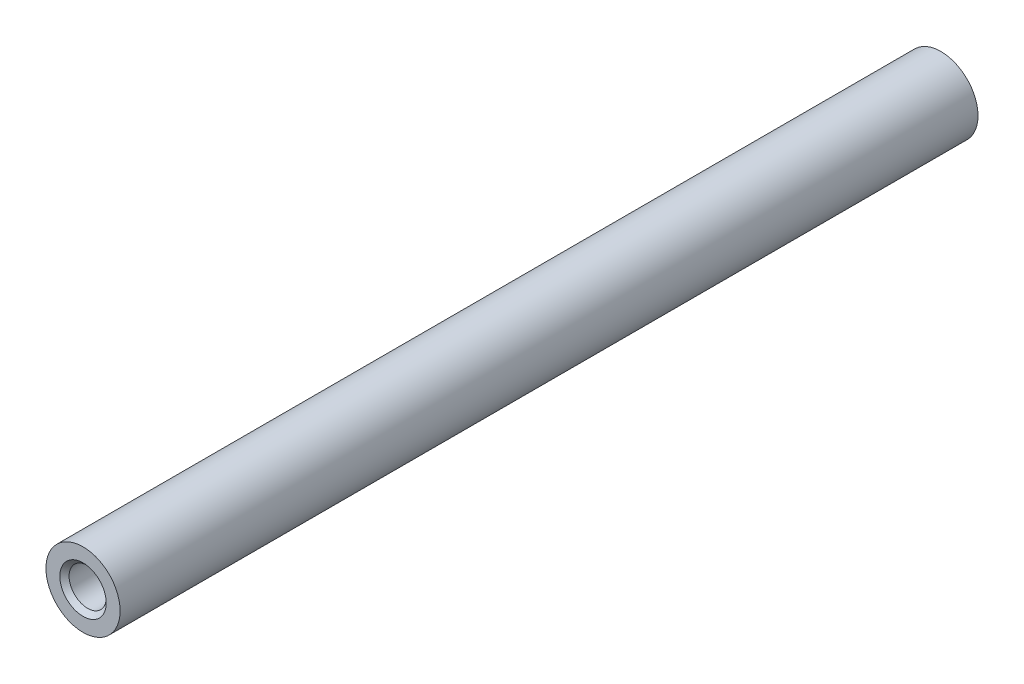
ISO-10303-21;
HEADER;
FILE_DESCRIPTION(('STEP AP214'),'2;1');
FILE_NAME('part.step','',(''),(''),'','','');
FILE_SCHEMA(('AUTOMOTIVE_DESIGN { 1 0 10303 214 1 1 1 1 }'));
ENDSEC;
DATA;
#1=APPLICATION_CONTEXT('core data for automotive mechanical design processes');
#2=APPLICATION_PROTOCOL_DEFINITION('international standard','automotive_design',2000,#1);
#3=PRODUCT_CONTEXT('',#1,'mechanical');
#4=PRODUCT('Part','Part','',(#3));
#5=PRODUCT_RELATED_PRODUCT_CATEGORY('part','',(#4));
#6=PRODUCT_DEFINITION_FORMATION('','',#4);
#7=PRODUCT_DEFINITION_CONTEXT('part definition',#1,'design');
#8=PRODUCT_DEFINITION('design','',#6,#7);
#9=PRODUCT_DEFINITION_SHAPE('','',#8);
#10=(LENGTH_UNIT() NAMED_UNIT(*) SI_UNIT(.MILLI.,.METRE.));
#11=(NAMED_UNIT(*) PLANE_ANGLE_UNIT() SI_UNIT($,.RADIAN.));
#12=(NAMED_UNIT(*) SI_UNIT($,.STERADIAN.) SOLID_ANGLE_UNIT());
#13=UNCERTAINTY_MEASURE_WITH_UNIT(LENGTH_MEASURE(1.E-05),#10,'distance_accuracy_value','');
#14=(GEOMETRIC_REPRESENTATION_CONTEXT(3) GLOBAL_UNCERTAINTY_ASSIGNED_CONTEXT((#13)) GLOBAL_UNIT_ASSIGNED_CONTEXT((#10,
#11,#12)) REPRESENTATION_CONTEXT('',''));
#15=CARTESIAN_POINT('',(0.,0.,0.));
#16=DIRECTION('',(0.,0.,1.));
#17=DIRECTION('',(1.,0.,0.));
#18=AXIS2_PLACEMENT_3D('',#15,#16,#17);
#19=CARTESIAN_POINT('',(0.,0.,92.5));
#20=DIRECTION('',(0.,0.,-1.));
#21=DIRECTION('',(-1.,0.,0.));
#22=AXIS2_PLACEMENT_3D('',#19,#20,#21);
#23=CYLINDRICAL_SURFACE('',#22,4.);
#24=CARTESIAN_POINT('',(0.,0.,91.5));
#25=DIRECTION('',(0.,0.,1.));
#26=DIRECTION('',(1.,0.,0.));
#27=AXIS2_PLACEMENT_3D('',#24,#25,#26);
#28=CIRCLE('',#27,4.);
#29=CARTESIAN_POINT('',(4.,0.,91.5));
#30=VERTEX_POINT('',#29);
#31=EDGE_CURVE('E47',#30,#30,#28,.T.);
#32=ORIENTED_EDGE('',*,*,#31,.T.);
#33=EDGE_LOOP('',(#32));
#34=FACE_BOUND('',#33,.T.);
#35=CARTESIAN_POINT('',(0.,0.,-62.5));
#36=DIRECTION('',(0.,0.,-1.));
#37=DIRECTION('',(-1.,0.,0.));
#38=AXIS2_PLACEMENT_3D('',#35,#36,#37);
#39=CIRCLE('',#38,4.);
#40=CARTESIAN_POINT('',(-4.,0.,-62.5));
#41=VERTEX_POINT('',#40);
#42=EDGE_CURVE('E58',#41,#41,#39,.T.);
#43=ORIENTED_EDGE('',*,*,#42,.T.);
#44=EDGE_LOOP('',(#43));
#45=FACE_BOUND('',#44,.T.);
#46=ADVANCED_FACE('F39',(#34,#45),#23,.F.);
#47=CARTESIAN_POINT('',(0.,0.,92.5));
#48=DIRECTION('',(0.,0.,1.));
#49=DIRECTION('',(1.,0.,0.));
#50=AXIS2_PLACEMENT_3D('',#47,#48,#49);
#51=PLANE('',#50);
#52=CARTESIAN_POINT('',(0.,0.,92.5));
#53=DIRECTION('',(0.,0.,1.));
#54=DIRECTION('',(1.,0.,0.));
#55=AXIS2_PLACEMENT_3D('',#52,#53,#54);
#56=CIRCLE('',#55,4.99999999999998);
#57=CARTESIAN_POINT('',(4.99999999999998,0.,92.5));
#58=VERTEX_POINT('',#57);
#59=EDGE_CURVE('E10',#58,#58,#56,.F.);
#60=ORIENTED_EDGE('',*,*,#59,.T.);
#61=EDGE_LOOP('',(#60));
#62=FACE_BOUND('',#61,.T.);
#63=CARTESIAN_POINT('',(0.,0.,92.5));
#64=DIRECTION('',(0.,0.,1.));
#65=DIRECTION('',(1.,0.,0.));
#66=AXIS2_PLACEMENT_3D('',#63,#64,#65);
#67=CIRCLE('',#66,8.);
#68=CARTESIAN_POINT('',(8.,0.,92.5));
#69=VERTEX_POINT('',#68);
#70=EDGE_CURVE('E51',#69,#69,#67,.T.);
#71=ORIENTED_EDGE('',*,*,#70,.T.);
#72=EDGE_LOOP('',(#71));
#73=FACE_BOUND('',#72,.T.);
#74=ADVANCED_FACE('F82',(#62,#73),#51,.T.);
#75=CARTESIAN_POINT('',(0.,0.,-92.5));
#76=DIRECTION('',(0.,0.,1.));
#77=DIRECTION('',(1.,0.,0.));
#78=AXIS2_PLACEMENT_3D('',#75,#76,#77);
#79=PLANE('',#78);
#80=CARTESIAN_POINT('',(0.,0.,-92.5));
#81=DIRECTION('',(0.,0.,-1.));
#82=DIRECTION('',(-1.,0.,0.));
#83=AXIS2_PLACEMENT_3D('',#80,#81,#82);
#84=CIRCLE('',#83,5.);
#85=CARTESIAN_POINT('',(-5.,0.,-92.5));
#86=VERTEX_POINT('',#85);
#87=EDGE_CURVE('E64',#86,#86,#84,.T.);
#88=ORIENTED_EDGE('',*,*,#87,.F.);
#89=EDGE_LOOP('',(#88));
#90=FACE_BOUND('',#89,.T.);
#91=CARTESIAN_POINT('',(0.,0.,-92.5));
#92=DIRECTION('',(0.,0.,1.));
#93=DIRECTION('',(1.,0.,0.));
#94=AXIS2_PLACEMENT_3D('',#91,#92,#93);
#95=CIRCLE('',#94,8.);
#96=CARTESIAN_POINT('',(8.,0.,-92.5));
#97=VERTEX_POINT('',#96);
#98=EDGE_CURVE('E55',#97,#97,#95,.T.);
#99=ORIENTED_EDGE('',*,*,#98,.F.);
#100=EDGE_LOOP('',(#99));
#101=FACE_BOUND('',#100,.T.);
#102=ADVANCED_FACE('F79',(#90,#101),#79,.F.);
#103=CARTESIAN_POINT('',(0.,0.,92.5));
#104=DIRECTION('',(0.,0.,-1.));
#105=DIRECTION('',(-1.,0.,0.));
#106=AXIS2_PLACEMENT_3D('',#103,#104,#105);
#107=CYLINDRICAL_SURFACE('',#106,8.);
#108=ORIENTED_EDGE('',*,*,#70,.F.);
#109=EDGE_LOOP('',(#108));
#110=FACE_BOUND('',#109,.T.);
#111=ORIENTED_EDGE('',*,*,#98,.T.);
#112=EDGE_LOOP('',(#111));
#113=FACE_BOUND('',#112,.T.);
#114=ADVANCED_FACE('F75',(#110,#113),#107,.T.);
#115=CARTESIAN_POINT('',(0.,0.,-62.5));
#116=DIRECTION('',(0.,0.,-1.));
#117=DIRECTION('',(-1.,0.,0.));
#118=AXIS2_PLACEMENT_3D('',#115,#116,#117);
#119=CYLINDRICAL_SURFACE('',#118,5.);
#120=CARTESIAN_POINT('',(0.,0.,-62.5));
#121=DIRECTION('',(0.,0.,-1.));
#122=DIRECTION('',(-1.,0.,0.));
#123=AXIS2_PLACEMENT_3D('',#120,#121,#122);
#124=CIRCLE('',#123,5.);
#125=CARTESIAN_POINT('',(-5.,0.,-62.5));
#126=VERTEX_POINT('',#125);
#127=EDGE_CURVE('E61',#126,#126,#124,.T.);
#128=ORIENTED_EDGE('',*,*,#127,.F.);
#129=EDGE_LOOP('',(#128));
#130=FACE_BOUND('',#129,.T.);
#131=ORIENTED_EDGE('',*,*,#87,.T.);
#132=EDGE_LOOP('',(#131));
#133=FACE_BOUND('',#132,.T.);
#134=ADVANCED_FACE('F72',(#130,#133),#119,.F.);
#135=CARTESIAN_POINT('',(0.,0.,-62.5));
#136=DIRECTION('',(0.,0.,-1.));
#137=DIRECTION('',(-1.,0.,0.));
#138=AXIS2_PLACEMENT_3D('',#135,#136,#137);
#139=PLANE('',#138);
#140=ORIENTED_EDGE('',*,*,#42,.F.);
#141=EDGE_LOOP('',(#140));
#142=FACE_BOUND('',#141,.T.);
#143=ORIENTED_EDGE('',*,*,#127,.T.);
#144=EDGE_LOOP('',(#143));
#145=FACE_BOUND('',#144,.T.);
#146=ADVANCED_FACE('F70',(#142,#145),#139,.T.);
#147=CARTESIAN_POINT('',(0.,0.,91.5));
#148=DIRECTION('',(0.,0.,1.));
#149=DIRECTION('',(1.,0.,0.));
#150=AXIS2_PLACEMENT_3D('',#147,#148,#149);
#151=CONICAL_SURFACE('',#150,4.,0.785398163397443);
#152=ORIENTED_EDGE('',*,*,#59,.F.);
#153=EDGE_LOOP('',(#152));
#154=FACE_BOUND('',#153,.T.);
#155=ORIENTED_EDGE('',*,*,#31,.F.);
#156=EDGE_LOOP('',(#155));
#157=FACE_BOUND('',#156,.T.);
#158=ADVANCED_FACE('F42',(#154,#157),#151,.F.);
#159=CLOSED_SHELL('',(#46,#74,#102,#114,#134,#146,#158));
#160=MANIFOLD_SOLID_BREP('B2',#159);
#161=ADVANCED_BREP_SHAPE_REPRESENTATION('',(#18,#160),#14);
#162=SHAPE_DEFINITION_REPRESENTATION(#9,#161);
ENDSEC;
END-ISO-10303-21;
